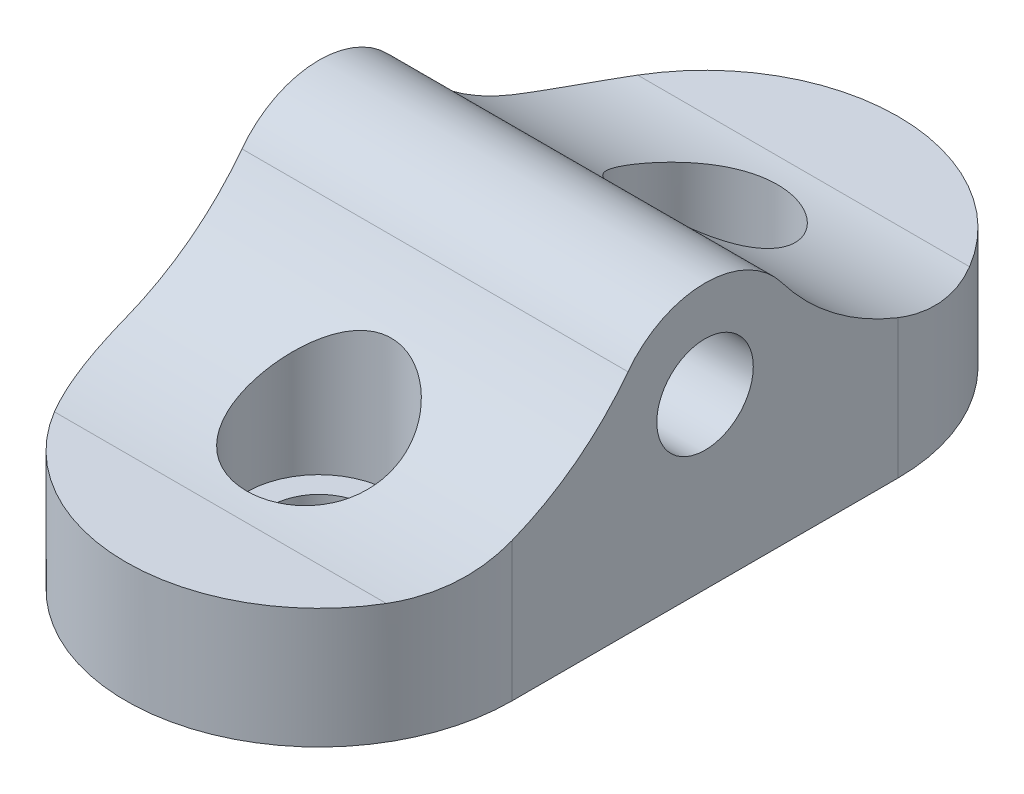
ISO-10303-21;
HEADER;
FILE_DESCRIPTION(('STEP AP214'),'2;1');
FILE_NAME('part.step','',(''),(''),'','','');
FILE_SCHEMA(('AUTOMOTIVE_DESIGN { 1 0 10303 214 1 1 1 1 }'));
ENDSEC;
DATA;
#1=APPLICATION_CONTEXT('core data for automotive mechanical design processes');
#2=APPLICATION_PROTOCOL_DEFINITION('international standard','automotive_design',2000,#1);
#3=PRODUCT_CONTEXT('',#1,'mechanical');
#4=PRODUCT('Part','Part','',(#3));
#5=PRODUCT_RELATED_PRODUCT_CATEGORY('part','',(#4));
#6=PRODUCT_DEFINITION_FORMATION('','',#4);
#7=PRODUCT_DEFINITION_CONTEXT('part definition',#1,'design');
#8=PRODUCT_DEFINITION('design','',#6,#7);
#9=PRODUCT_DEFINITION_SHAPE('','',#8);
#10=(LENGTH_UNIT() NAMED_UNIT(*) SI_UNIT(.MILLI.,.METRE.));
#11=(NAMED_UNIT(*) PLANE_ANGLE_UNIT() SI_UNIT($,.RADIAN.));
#12=(NAMED_UNIT(*) SI_UNIT($,.STERADIAN.) SOLID_ANGLE_UNIT());
#13=UNCERTAINTY_MEASURE_WITH_UNIT(LENGTH_MEASURE(1.E-05),#10,'distance_accuracy_value','');
#14=(GEOMETRIC_REPRESENTATION_CONTEXT(3) GLOBAL_UNCERTAINTY_ASSIGNED_CONTEXT((#13)) GLOBAL_UNIT_ASSIGNED_CONTEXT((#10,
#11,#12)) REPRESENTATION_CONTEXT('',''));
#15=CARTESIAN_POINT('',(0.,0.,0.));
#16=DIRECTION('',(0.,0.,1.));
#17=DIRECTION('',(1.,0.,0.));
#18=AXIS2_PLACEMENT_3D('',#15,#16,#17);
#19=CARTESIAN_POINT('',(0.,25.4,-12.7));
#20=DIRECTION('',(0.,-1.,0.));
#21=DIRECTION('',(0.,0.,-1.));
#22=AXIS2_PLACEMENT_3D('',#19,#20,#21);
#23=CYLINDRICAL_SURFACE('',#22,3.175);
#24=CARTESIAN_POINT('',(0.,0.,-12.7));
#25=DIRECTION('',(0.,1.,0.));
#26=DIRECTION('',(0.,0.,1.));
#27=AXIS2_PLACEMENT_3D('',#24,#25,#26);
#28=CIRCLE('',#27,3.175);
#29=CARTESIAN_POINT('',(0.,0.,-9.525));
#30=VERTEX_POINT('',#29);
#31=EDGE_CURVE('E225',#30,#30,#28,.T.);
#32=ORIENTED_EDGE('',*,*,#31,.F.);
#33=EDGE_LOOP('',(#32));
#34=FACE_BOUND('',#33,.T.);
#35=CARTESIAN_POINT('',(0.,3.175,-12.7));
#36=DIRECTION('',(0.,1.,0.));
#37=DIRECTION('',(0.,0.,1.));
#38=AXIS2_PLACEMENT_3D('',#35,#36,#37);
#39=CIRCLE('',#38,3.175);
#40=CARTESIAN_POINT('',(0.,3.175,-9.525));
#41=VERTEX_POINT('',#40);
#42=EDGE_CURVE('E42',#41,#41,#39,.T.);
#43=ORIENTED_EDGE('',*,*,#42,.T.);
#44=EDGE_LOOP('',(#43));
#45=FACE_BOUND('',#44,.T.);
#46=ADVANCED_FACE('F37',(#34,#45),#23,.F.);
#47=CARTESIAN_POINT('',(0.,25.4,12.7));
#48=DIRECTION('',(0.,-1.,0.));
#49=DIRECTION('',(0.,0.,-1.));
#50=AXIS2_PLACEMENT_3D('',#47,#48,#49);
#51=CYLINDRICAL_SURFACE('',#50,3.175);
#52=CARTESIAN_POINT('',(0.,0.,12.7));
#53=DIRECTION('',(0.,1.,0.));
#54=DIRECTION('',(0.,0.,1.));
#55=AXIS2_PLACEMENT_3D('',#52,#53,#54);
#56=CIRCLE('',#55,3.175);
#57=CARTESIAN_POINT('',(0.,0.,15.875));
#58=VERTEX_POINT('',#57);
#59=EDGE_CURVE('E222',#58,#58,#56,.T.);
#60=ORIENTED_EDGE('',*,*,#59,.F.);
#61=EDGE_LOOP('',(#60));
#62=FACE_BOUND('',#61,.T.);
#63=CARTESIAN_POINT('',(0.,3.175,12.7));
#64=DIRECTION('',(0.,1.,0.));
#65=DIRECTION('',(0.,0.,1.));
#66=AXIS2_PLACEMENT_3D('',#63,#64,#65);
#67=CIRCLE('',#66,3.175);
#68=CARTESIAN_POINT('',(0.,3.175,15.875));
#69=VERTEX_POINT('',#68);
#70=EDGE_CURVE('E393',#69,#69,#67,.T.);
#71=ORIENTED_EDGE('',*,*,#70,.T.);
#72=EDGE_LOOP('',(#71));
#73=FACE_BOUND('',#72,.T.);
#74=ADVANCED_FACE('F268',(#62,#73),#51,.F.);
#75=CARTESIAN_POINT('',(0.,0.,-12.7));
#76=DIRECTION('',(0.,1.,0.));
#77=DIRECTION('',(0.,0.,1.));
#78=AXIS2_PLACEMENT_3D('',#75,#76,#77);
#79=PLANE('',#78);
#80=CARTESIAN_POINT('',(0.,0.,-12.7));
#81=DIRECTION('',(0.,1.,0.));
#82=DIRECTION('',(0.,0.,1.));
#83=AXIS2_PLACEMENT_3D('',#80,#81,#82);
#84=CIRCLE('',#83,12.7);
#85=CARTESIAN_POINT('',(12.7,0.,-12.7));
#86=VERTEX_POINT('',#85);
#87=CARTESIAN_POINT('',(-12.7,0.,-12.7));
#88=VERTEX_POINT('',#87);
#89=EDGE_CURVE('E228',#86,#88,#84,.T.);
#90=ORIENTED_EDGE('',*,*,#89,.F.);
#91=DIRECTION('',(0.,0.,-1.));
#92=VECTOR('',#91,1.);
#93=CARTESIAN_POINT('',(12.7,0.,-12.7));
#94=LINE('',#93,#92);
#95=CARTESIAN_POINT('',(12.7,0.,12.7));
#96=VERTEX_POINT('',#95);
#97=EDGE_CURVE('E236',#96,#86,#94,.T.);
#98=ORIENTED_EDGE('',*,*,#97,.F.);
#99=CARTESIAN_POINT('',(0.,0.,12.7));
#100=DIRECTION('',(0.,1.,0.));
#101=DIRECTION('',(0.,0.,1.));
#102=AXIS2_PLACEMENT_3D('',#99,#100,#101);
#103=CIRCLE('',#102,12.7);
#104=CARTESIAN_POINT('',(-12.7,0.,12.7));
#105=VERTEX_POINT('',#104);
#106=EDGE_CURVE('E233',#105,#96,#103,.T.);
#107=ORIENTED_EDGE('',*,*,#106,.F.);
#108=DIRECTION('',(0.,0.,1.));
#109=VECTOR('',#108,1.);
#110=CARTESIAN_POINT('',(-12.7,0.,-12.7));
#111=LINE('',#110,#109);
#112=EDGE_CURVE('E230',#88,#105,#111,.T.);
#113=ORIENTED_EDGE('',*,*,#112,.F.);
#114=EDGE_LOOP('',(#90,#98,#107,#113));
#115=FACE_BOUND('',#114,.T.);
#116=ORIENTED_EDGE('',*,*,#31,.T.);
#117=EDGE_LOOP('',(#116));
#118=FACE_BOUND('',#117,.T.);
#119=ORIENTED_EDGE('',*,*,#59,.T.);
#120=EDGE_LOOP('',(#119));
#121=FACE_BOUND('',#120,.T.);
#122=ADVANCED_FACE('F256',(#115,#118,#121),#79,.F.);
#123=CARTESIAN_POINT('',(0.,25.4,-12.7));
#124=DIRECTION('',(0.,-1.,0.));
#125=DIRECTION('',(0.,0.,-1.));
#126=AXIS2_PLACEMENT_3D('',#123,#124,#125);
#127=CYLINDRICAL_SURFACE('',#126,12.7);
#128=CARTESIAN_POINT('',(-12.7,9.13804033762749,-12.7));
#129=CARTESIAN_POINT('',(-12.7000005866934,9.08164824123594,-12.843059101073));
#130=CARTESIAN_POINT('',(-12.6975820902846,9.02713059198029,-12.9868404265366));
#131=CARTESIAN_POINT('',(-12.6877707355619,8.9219084830553,-13.2756338677902));
#132=CARTESIAN_POINT('',(-12.6803775366066,8.87120428477524,-13.4206460671926));
#133=CARTESIAN_POINT('',(-12.6505310218572,8.72491450433517,-13.8571938798743));
#134=CARTESIAN_POINT('',(-12.6204107600428,8.63515756392982,-14.1502259139768));
#135=CARTESIAN_POINT('',(-12.5400606883423,8.47384705248073,-14.7298227684027));
#136=CARTESIAN_POINT('',(-12.4903963556061,8.40186707820088,-15.0163483411766));
#137=CARTESIAN_POINT('',(-12.3706126521038,8.27309288523471,-15.5884793354811));
#138=CARTESIAN_POINT('',(-12.3004985880759,8.21629473415985,-15.8740849763196));
#139=CARTESIAN_POINT('',(-12.1467715140994,8.12188635151893,-16.4173329046593));
#140=CARTESIAN_POINT('',(-12.064864665661,8.08303629254419,-16.6752453581526));
#141=CARTESIAN_POINT('',(-11.8841638650542,8.01728105812456,-17.186671235499));
#142=CARTESIAN_POINT('',(-11.78536816929,7.99037711702351,-17.4401842021718));
#143=CARTESIAN_POINT('',(-11.568579162017,7.94732446901488,-17.947467612124));
#144=CARTESIAN_POINT('',(-11.4501624028256,7.93146593255324,-18.2010814237486));
#145=CARTESIAN_POINT('',(-11.1966742750403,7.91066459405406,-18.7002571243969));
#146=CARTESIAN_POINT('',(-11.061605826167,7.90571988124402,-18.9458204154736));
#147=CARTESIAN_POINT('',(-10.9185278440872,7.90575,-19.18658228329));
#148=B_SPLINE_CURVE_WITH_KNOTS('',3,(#128,#129,#130,#131,#132,#133,#134,#135,#136,#137,#138,
#139,#140,#141,#142,#143,#144,#145,#146,#147),.UNSPECIFIED.,.F.,.F.,(4,2,2,2,2,2,2,2,2,4),(0.,
0.461251892542678,0.922535372388279,1.8451498812733,2.74282995799088,3.64027729223213,
4.45960970021409,5.27902674679715,6.11923198368918,6.95929010729535),.UNSPECIFIED.);
#149=CARTESIAN_POINT('',(-12.7,9.13804033762749,-12.7));
#150=VERTEX_POINT('',#149);
#151=CARTESIAN_POINT('',(-10.9185278440872,7.90575,-19.18658228329));
#152=VERTEX_POINT('',#151);
#153=EDGE_CURVE('E216',#150,#152,#148,.T.);
#154=ORIENTED_EDGE('',*,*,#153,.T.);
#155=CARTESIAN_POINT('',(0.,7.90575,-12.7));
#156=DIRECTION('',(0.,-1.,0.));
#157=DIRECTION('',(0.,0.,-1.));
#158=AXIS2_PLACEMENT_3D('',#155,#156,#157);
#159=CIRCLE('',#158,12.7);
#160=CARTESIAN_POINT('',(10.9185278440873,7.90575,-19.18658228329));
#161=VERTEX_POINT('',#160);
#162=EDGE_CURVE('E12',#152,#161,#159,.T.);
#163=ORIENTED_EDGE('',*,*,#162,.T.);
#164=CARTESIAN_POINT('',(10.9185278440873,7.90575,-19.18658228329));
#165=CARTESIAN_POINT('',(10.9970706401114,7.90574930958121,-19.0543764777048));
#166=CARTESIAN_POINT('',(11.0732022836872,7.90723269483922,-18.920757120913));
#167=CARTESIAN_POINT('',(11.2205407794781,7.91334831121593,-18.6508910926291));
#168=CARTESIAN_POINT('',(11.2917473343572,7.91798073226486,-18.5146442631459));
#169=CARTESIAN_POINT('',(11.4978193995035,7.93687306533883,-18.1022713369251));
#170=CARTESIAN_POINT('',(11.6251286313526,7.95612808719573,-17.8225274170901));
#171=CARTESIAN_POINT('',(11.8555507161374,8.00842632953805,-17.2634296254019));
#172=CARTESIAN_POINT('',(11.9592247627264,8.04108263244161,-16.984269750784));
#173=CARTESIAN_POINT('',(12.146187340975,8.12092949943563,-16.4212975203358));
#174=CARTESIAN_POINT('',(12.2294811880783,8.16811626650899,-16.137486398265));
#175=CARTESIAN_POINT('',(12.3691794889657,8.27274784515276,-15.5923275219183));
#176=CARTESIAN_POINT('',(12.4272935442663,8.32894204342089,-15.3311750891658));
#177=CARTESIAN_POINT('',(12.5265465383385,8.45398553795211,-14.8086419047588));
#178=CARTESIAN_POINT('',(12.567683690104,8.52283616534178,-14.5472611319694));
#179=CARTESIAN_POINT('',(12.6341436598931,8.67501411020532,-14.0194311379533));
#180=CARTESIAN_POINT('',(12.6590389472424,8.75866429056236,-13.7530214929481));
#181=CARTESIAN_POINT('',(12.6919837970719,8.93880822507675,-13.2235715943371));
#182=CARTESIAN_POINT('',(12.7000364222955,9.03529964073266,-12.9605307367842));
#183=CARTESIAN_POINT('',(12.7,9.13804033762749,-12.7));
#184=B_SPLINE_CURVE_WITH_KNOTS('',3,(#164,#165,#166,#167,#168,#169,#170,#171,#172,#173,#174,
#175,#176,#177,#178,#179,#180,#181,#182,#183),.UNSPECIFIED.,.F.,.F.,(4,2,2,2,2,2,2,2,2,4),(0.,
0.461263801610389,0.922555426252143,1.84518950609271,2.74287517726624,3.64032646917472,
4.45965058198705,5.27906091570263,6.11925253231032,6.95929135150384),.UNSPECIFIED.);
#185=CARTESIAN_POINT('',(12.7,9.13804033762749,-12.7));
#186=VERTEX_POINT('',#185);
#187=EDGE_CURVE('E212',#161,#186,#184,.T.);
#188=ORIENTED_EDGE('',*,*,#187,.T.);
#189=DIRECTION('',(0.,-1.,0.));
#190=VECTOR('',#189,1.);
#191=CARTESIAN_POINT('',(12.7,25.4,-12.7));
#192=LINE('',#191,#190);
#193=EDGE_CURVE('E63',#186,#86,#192,.T.);
#194=ORIENTED_EDGE('',*,*,#193,.T.);
#195=ORIENTED_EDGE('',*,*,#89,.T.);
#196=DIRECTION('',(0.,-1.,0.));
#197=VECTOR('',#196,1.);
#198=CARTESIAN_POINT('',(-12.7,25.4,-12.7));
#199=LINE('',#198,#197);
#200=EDGE_CURVE('E243',#150,#88,#199,.T.);
#201=ORIENTED_EDGE('',*,*,#200,.F.);
#202=EDGE_LOOP('',(#154,#163,#188,#194,#195,#201));
#203=FACE_BOUND('',#202,.T.);
#204=ADVANCED_FACE('F39',(#203),#127,.T.);
#205=CARTESIAN_POINT('',(-12.7,25.4,-12.7));
#206=DIRECTION('',(1.,0.,0.));
#207=DIRECTION('',(0.,0.,-1.));
#208=AXIS2_PLACEMENT_3D('',#205,#206,#207);
#209=PLANE('',#208);
#210=CARTESIAN_POINT('',(-12.7,11.1125,0.));
#211=DIRECTION('',(1.,0.,0.));
#212=DIRECTION('',(0.,0.,-1.));
#213=AXIS2_PLACEMENT_3D('',#210,#211,#212);
#214=CIRCLE('',#213,3.175);
#215=CARTESIAN_POINT('',(-12.7,11.1125,-3.175));
#216=VERTEX_POINT('',#215);
#217=EDGE_CURVE('E145',#216,#216,#214,.T.);
#218=ORIENTED_EDGE('',*,*,#217,.T.);
#219=EDGE_LOOP('',(#218));
#220=FACE_BOUND('',#219,.T.);
#221=CARTESIAN_POINT('',(-12.7,11.1125,0.));
#222=DIRECTION('',(-1.,0.,0.));
#223=DIRECTION('',(0.,0.,1.));
#224=AXIS2_PLACEMENT_3D('',#221,#222,#223);
#225=CIRCLE('',#224,6.35);
#226=CARTESIAN_POINT('',(-12.7,14.937973950952,5.06835762852109));
#227=VERTEX_POINT('',#226);
#228=CARTESIAN_POINT('',(-12.7,14.937973950952,-5.06835762852109));
#229=VERTEX_POINT('',#228);
#230=EDGE_CURVE('E120',#227,#229,#225,.T.);
#231=ORIENTED_EDGE('',*,*,#230,.T.);
#232=CARTESIAN_POINT('',(-12.7,25.5940690036339,-19.18658228329));
#233=DIRECTION('',(1.,0.,0.));
#234=DIRECTION('',(0.,0.,-1.));
#235=AXIS2_PLACEMENT_3D('',#232,#233,#234);
#236=CIRCLE('',#235,17.6883190036339);
#237=EDGE_CURVE('E134',#229,#150,#236,.T.);
#238=ORIENTED_EDGE('',*,*,#237,.T.);
#239=ORIENTED_EDGE('',*,*,#200,.T.);
#240=ORIENTED_EDGE('',*,*,#112,.T.);
#241=DIRECTION('',(0.,-1.,0.));
#242=VECTOR('',#241,1.);
#243=CARTESIAN_POINT('',(-12.7,25.4,12.7));
#244=LINE('',#243,#242);
#245=CARTESIAN_POINT('',(-12.7,9.13804033762749,12.7));
#246=VERTEX_POINT('',#245);
#247=EDGE_CURVE('E241',#246,#105,#244,.T.);
#248=ORIENTED_EDGE('',*,*,#247,.F.);
#249=CARTESIAN_POINT('',(-12.7,25.5940690036339,19.18658228329));
#250=DIRECTION('',(1.,0.,0.));
#251=DIRECTION('',(0.,0.,-1.));
#252=AXIS2_PLACEMENT_3D('',#249,#250,#251);
#253=CIRCLE('',#252,17.6883190036339);
#254=EDGE_CURVE('E128',#246,#227,#253,.T.);
#255=ORIENTED_EDGE('',*,*,#254,.T.);
#256=EDGE_LOOP('',(#231,#238,#239,#240,#248,#255));
#257=FACE_BOUND('',#256,.T.);
#258=ADVANCED_FACE('F250',(#220,#257),#209,.F.);
#259=CARTESIAN_POINT('',(0.,25.4,12.7));
#260=DIRECTION('',(0.,-1.,0.));
#261=DIRECTION('',(0.,0.,-1.));
#262=AXIS2_PLACEMENT_3D('',#259,#260,#261);
#263=CYLINDRICAL_SURFACE('',#262,12.7);
#264=DIRECTION('',(0.,-1.,0.));
#265=VECTOR('',#264,1.);
#266=CARTESIAN_POINT('',(12.7,25.4,12.7));
#267=LINE('',#266,#265);
#268=CARTESIAN_POINT('',(12.7,9.13804033762749,12.7));
#269=VERTEX_POINT('',#268);
#270=EDGE_CURVE('E239',#269,#96,#267,.T.);
#271=ORIENTED_EDGE('',*,*,#270,.F.);
#272=CARTESIAN_POINT('',(12.7,9.13804033762749,12.7));
#273=CARTESIAN_POINT('',(12.7000005866934,9.08164824123594,12.843059101073));
#274=CARTESIAN_POINT('',(12.6975820902847,9.02713059198029,12.9868404265366));
#275=CARTESIAN_POINT('',(12.6877707355619,8.9219084830553,13.2756338677902));
#276=CARTESIAN_POINT('',(12.6803775366067,8.87120428477524,13.4206460671926));
#277=CARTESIAN_POINT('',(12.6505310218572,8.72491450433516,13.8571938798743));
#278=CARTESIAN_POINT('',(12.6204107600428,8.63515756392982,14.1502259139768));
#279=CARTESIAN_POINT('',(12.5400606883423,8.47384705248072,14.7298227684027));
#280=CARTESIAN_POINT('',(12.4903963556061,8.40186707820088,15.0163483411766));
#281=CARTESIAN_POINT('',(12.3706126521038,8.27309288523471,15.5884793354811));
#282=CARTESIAN_POINT('',(12.3004985880759,8.21629473415985,15.8740849763196));
#283=CARTESIAN_POINT('',(12.1467715140994,8.12188635151893,16.4173329046593));
#284=CARTESIAN_POINT('',(12.064864665661,8.08303629254419,16.6752453581526));
#285=CARTESIAN_POINT('',(11.8841638650543,8.01728105812456,17.186671235499));
#286=CARTESIAN_POINT('',(11.78536816929,7.99037711702351,17.4401842021718));
#287=CARTESIAN_POINT('',(11.568579162017,7.94732446901488,17.947467612124));
#288=CARTESIAN_POINT('',(11.4501624028256,7.93146593255324,18.2010814237486));
#289=CARTESIAN_POINT('',(11.1966742750403,7.91066459405407,18.700257124397));
#290=CARTESIAN_POINT('',(11.061605826167,7.90571988124402,18.9458204154736));
#291=CARTESIAN_POINT('',(10.9185278440873,7.90575,19.18658228329));
#292=B_SPLINE_CURVE_WITH_KNOTS('',3,(#272,#273,#274,#275,#276,#277,#278,#279,#280,#281,#282,
#283,#284,#285,#286,#287,#288,#289,#290,#291),.UNSPECIFIED.,.F.,.F.,(4,2,2,2,2,2,2,2,2,4),(0.,
0.461251892542679,0.922535372388281,1.8451498812733,2.74282995799088,3.64027729223213,
4.45960970021408,5.27902674679715,6.11923198368919,6.95929010729536),.UNSPECIFIED.);
#293=CARTESIAN_POINT('',(10.9185278440873,7.90575,19.18658228329));
#294=VERTEX_POINT('',#293);
#295=EDGE_CURVE('E55',#269,#294,#292,.T.);
#296=ORIENTED_EDGE('',*,*,#295,.T.);
#297=CARTESIAN_POINT('',(0.,7.90575,12.7));
#298=DIRECTION('',(0.,-1.,0.));
#299=DIRECTION('',(0.,0.,-1.));
#300=AXIS2_PLACEMENT_3D('',#297,#298,#299);
#301=CIRCLE('',#300,12.7);
#302=CARTESIAN_POINT('',(-10.9185278440872,7.90575,19.18658228329));
#303=VERTEX_POINT('',#302);
#304=EDGE_CURVE('E47',#294,#303,#301,.T.);
#305=ORIENTED_EDGE('',*,*,#304,.T.);
#306=CARTESIAN_POINT('',(-10.9185278440872,7.90575,19.18658228329));
#307=CARTESIAN_POINT('',(-10.9970706401114,7.90574930958121,19.0543764777049));
#308=CARTESIAN_POINT('',(-11.0732022836871,7.90723269483922,18.920757120913));
#309=CARTESIAN_POINT('',(-11.2205407794781,7.91334831121593,18.6508910926291));
#310=CARTESIAN_POINT('',(-11.2917473343572,7.91798073226486,18.5146442631459));
#311=CARTESIAN_POINT('',(-11.4978193995035,7.93687306533884,18.1022713369251));
#312=CARTESIAN_POINT('',(-11.6251286313525,7.95612808719574,17.8225274170901));
#313=CARTESIAN_POINT('',(-11.8555507161374,8.00842632953805,17.2634296254019));
#314=CARTESIAN_POINT('',(-11.9592247627264,8.04108263244161,16.984269750784));
#315=CARTESIAN_POINT('',(-12.146187340975,8.12092949943563,16.4212975203358));
#316=CARTESIAN_POINT('',(-12.2294811880782,8.16811626650898,16.137486398265));
#317=CARTESIAN_POINT('',(-12.3691794889657,8.27274784515275,15.5923275219183));
#318=CARTESIAN_POINT('',(-12.4272935442663,8.32894204342088,15.3311750891658));
#319=CARTESIAN_POINT('',(-12.5265465383384,8.4539855379521,14.8086419047588));
#320=CARTESIAN_POINT('',(-12.567683690104,8.52283616534178,14.5472611319694));
#321=CARTESIAN_POINT('',(-12.6341436598931,8.67501411020532,14.0194311379533));
#322=CARTESIAN_POINT('',(-12.6590389472424,8.75866429056235,13.7530214929481));
#323=CARTESIAN_POINT('',(-12.6919837970719,8.93880822507675,13.2235715943371));
#324=CARTESIAN_POINT('',(-12.7000364222955,9.03529964073266,12.9605307367842));
#325=CARTESIAN_POINT('',(-12.7,9.13804033762749,12.7));
#326=B_SPLINE_CURVE_WITH_KNOTS('',3,(#306,#307,#308,#309,#310,#311,#312,#313,#314,#315,#316,
#317,#318,#319,#320,#321,#322,#323,#324,#325),.UNSPECIFIED.,.F.,.F.,(4,2,2,2,2,2,2,2,2,4),(0.,
0.461263801610383,0.922555426252139,1.8451895060927,2.74287517726624,3.64032646917472,
4.45965058198705,5.27906091570263,6.11925253231032,6.95929135150385),.UNSPECIFIED.);
#327=EDGE_CURVE('E148',#303,#246,#326,.T.);
#328=ORIENTED_EDGE('',*,*,#327,.T.);
#329=ORIENTED_EDGE('',*,*,#247,.T.);
#330=ORIENTED_EDGE('',*,*,#106,.T.);
#331=EDGE_LOOP('',(#271,#296,#305,#328,#329,#330));
#332=FACE_BOUND('',#331,.T.);
#333=ADVANCED_FACE('F160',(#332),#263,.T.);
#334=CARTESIAN_POINT('',(12.7,25.4,-12.7));
#335=DIRECTION('',(-1.,0.,0.));
#336=DIRECTION('',(0.,0.,1.));
#337=AXIS2_PLACEMENT_3D('',#334,#335,#336);
#338=PLANE('',#337);
#339=CARTESIAN_POINT('',(12.7,11.1125,0.));
#340=DIRECTION('',(1.,0.,0.));
#341=DIRECTION('',(0.,0.,-1.));
#342=AXIS2_PLACEMENT_3D('',#339,#340,#341);
#343=CIRCLE('',#342,3.175);
#344=CARTESIAN_POINT('',(12.7,11.1125,-3.175));
#345=VERTEX_POINT('',#344);
#346=EDGE_CURVE('E140',#345,#345,#343,.T.);
#347=ORIENTED_EDGE('',*,*,#346,.F.);
#348=EDGE_LOOP('',(#347));
#349=FACE_BOUND('',#348,.T.);
#350=ORIENTED_EDGE('',*,*,#193,.F.);
#351=CARTESIAN_POINT('',(12.7,25.5940690036339,-19.18658228329));
#352=DIRECTION('',(1.,0.,0.));
#353=DIRECTION('',(0.,0.,-1.));
#354=AXIS2_PLACEMENT_3D('',#351,#352,#353);
#355=CIRCLE('',#354,17.6883190036339);
#356=CARTESIAN_POINT('',(12.7,14.937973950952,-5.06835762852109));
#357=VERTEX_POINT('',#356);
#358=EDGE_CURVE('E126',#357,#186,#355,.T.);
#359=ORIENTED_EDGE('',*,*,#358,.F.);
#360=CARTESIAN_POINT('',(12.7,11.1125,0.));
#361=DIRECTION('',(-1.,0.,0.));
#362=DIRECTION('',(0.,0.,1.));
#363=AXIS2_PLACEMENT_3D('',#360,#361,#362);
#364=CIRCLE('',#363,6.35);
#365=CARTESIAN_POINT('',(12.7,14.937973950952,5.06835762852109));
#366=VERTEX_POINT('',#365);
#367=EDGE_CURVE('E113',#366,#357,#364,.T.);
#368=ORIENTED_EDGE('',*,*,#367,.F.);
#369=CARTESIAN_POINT('',(12.7,25.5940690036339,19.18658228329));
#370=DIRECTION('',(1.,0.,0.));
#371=DIRECTION('',(0.,0.,-1.));
#372=AXIS2_PLACEMENT_3D('',#369,#370,#371);
#373=CIRCLE('',#372,17.6883190036339);
#374=EDGE_CURVE('E105',#269,#366,#373,.T.);
#375=ORIENTED_EDGE('',*,*,#374,.F.);
#376=ORIENTED_EDGE('',*,*,#270,.T.);
#377=ORIENTED_EDGE('',*,*,#97,.T.);
#378=EDGE_LOOP('',(#350,#359,#368,#375,#376,#377));
#379=FACE_BOUND('',#378,.T.);
#380=ADVANCED_FACE('F125',(#349,#379),#338,.F.);
#381=CARTESIAN_POINT('',(-12.7,7.90575,-19.18658228329));
#382=DIRECTION('',(0.,-1.,0.));
#383=DIRECTION('',(0.,0.,-1.));
#384=AXIS2_PLACEMENT_3D('',#381,#382,#383);
#385=PLANE('',#384);
#386=ORIENTED_EDGE('',*,*,#162,.F.);
#387=DIRECTION('',(1.,0.,0.));
#388=VECTOR('',#387,1.);
#389=CARTESIAN_POINT('',(-12.7,7.90575,-19.18658228329));
#390=LINE('',#389,#388);
#391=EDGE_CURVE('E137',#152,#161,#390,.T.);
#392=ORIENTED_EDGE('',*,*,#391,.T.);
#393=EDGE_LOOP('',(#386,#392));
#394=FACE_BOUND('',#393,.T.);
#395=ADVANCED_FACE('F203',(#394),#385,.F.);
#396=CARTESIAN_POINT('',(-12.7,7.90575,25.4));
#397=DIRECTION('',(0.,-1.,0.));
#398=DIRECTION('',(0.,0.,-1.));
#399=AXIS2_PLACEMENT_3D('',#396,#397,#398);
#400=PLANE('',#399);
#401=DIRECTION('',(1.,0.,0.));
#402=VECTOR('',#401,1.);
#403=CARTESIAN_POINT('',(-12.7,7.90575,19.18658228329));
#404=LINE('',#403,#402);
#405=EDGE_CURVE('E123',#303,#294,#404,.T.);
#406=ORIENTED_EDGE('',*,*,#405,.F.);
#407=ORIENTED_EDGE('',*,*,#304,.F.);
#408=EDGE_LOOP('',(#406,#407));
#409=FACE_BOUND('',#408,.T.);
#410=ADVANCED_FACE('F170',(#409),#400,.F.);
#411=CARTESIAN_POINT('',(-12.7,25.5940690036339,-19.18658228329));
#412=DIRECTION('',(1.,0.,0.));
#413=DIRECTION('',(0.,0.,-1.));
#414=AXIS2_PLACEMENT_3D('',#411,#412,#413);
#415=CYLINDRICAL_SURFACE('',#414,17.6883190036339);
#416=CARTESIAN_POINT('',(0.,11.9436193056171,-7.9375));
#417=CARTESIAN_POINT('',(-0.114547889188897,11.9436179371851,-7.93750117820442));
#418=CARTESIAN_POINT('',(-0.229137448629441,11.9402029616204,-7.94164166010331));
#419=CARTESIAN_POINT('',(-0.457375335535004,11.9266400650236,-7.95813069958161));
#420=CARTESIAN_POINT('',(-0.571022947808484,11.916487431502,-7.97048500212733));
#421=CARTESIAN_POINT('',(-0.796651433946876,11.8897112986826,-8.00321711280339));
#422=CARTESIAN_POINT('',(-0.908627990171046,11.8730733145297,-8.02361288251309));
#423=CARTESIAN_POINT('',(-1.12985188473524,11.8337883892044,-8.07207495469861));
#424=CARTESIAN_POINT('',(-1.23909789992839,11.8111385943535,-8.10014490013289));
#425=CARTESIAN_POINT('',(-1.55995887452641,11.7353986409865,-8.19474871849132));
#426=CARTESIAN_POINT('',(-1.76664752039363,11.6742708202301,-8.2719701778938));
#427=CARTESIAN_POINT('',(-2.16259431580371,11.5355543920586,-8.45123988847478));
#428=CARTESIAN_POINT('',(-2.35185487054196,11.4579680609273,-8.55328470676055));
#429=CARTESIAN_POINT('',(-2.73084313033479,11.2819934987394,-8.79113774151795));
#430=CARTESIAN_POINT('',(-2.91839567694296,11.1822618402615,-8.92940736573784));
#431=CARTESIAN_POINT('',(-3.26872584302175,10.9738666139177,-9.2286900956867));
#432=CARTESIAN_POINT('',(-3.4314876611264,10.8651974167351,-9.38971758205364));
#433=CARTESIAN_POINT('',(-3.76280480994887,10.6200343860175,-9.76768004966269));
#434=CARTESIAN_POINT('',(-3.92533609653092,10.4825076603848,-9.98924237764707));
#435=CARTESIAN_POINT('',(-4.21025906030397,10.207446651201,-10.4572016886412));
#436=CARTESIAN_POINT('',(-4.33262148703206,10.0699124347615,-10.7036165990612));
#437=CARTESIAN_POINT('',(-4.48801874703753,9.86191410910532,-11.0994962511783));
#438=CARTESIAN_POINT('',(-4.53636468187844,9.78940842213352,-11.2420542330515));
#439=CARTESIAN_POINT('',(-4.6195749554785,9.6468574633008,-11.5322278896405));
#440=CARTESIAN_POINT('',(-4.65444421475342,9.57681130194251,-11.679841696936));
#441=CARTESIAN_POINT('',(-4.71008969699553,9.43991910588595,-11.9791443412162));
#442=CARTESIAN_POINT('',(-4.73086683997036,9.37307286254502,-12.1308329115065));
#443=CARTESIAN_POINT('',(-4.75772426368844,9.24324777976056,-12.4371431288854));
#444=CARTESIAN_POINT('',(-4.76380596698426,9.18026856655484,-12.5917644906124));
#445=CARTESIAN_POINT('',(-4.76081758189668,9.06236220472126,-12.8934147404382));
#446=CARTESIAN_POINT('',(-4.75262182044623,9.0071791493659,-13.0403522079331));
#447=CARTESIAN_POINT('',(-4.72237361415267,8.90117616271615,-13.3343716074359));
#448=CARTESIAN_POINT('',(-4.70032277305867,8.85035572721481,-13.4814535207568));
#449=CARTESIAN_POINT('',(-4.64215189261785,8.75341814134725,-13.7742921861506));
#450=CARTESIAN_POINT('',(-4.60603991341115,8.70729831556833,-13.9200496485314));
#451=CARTESIAN_POINT('',(-4.51968886413408,8.619935618349,-14.2088144522196));
#452=CARTESIAN_POINT('',(-4.46945129896234,8.57869222805195,-14.3518220847526));
#453=CARTESIAN_POINT('',(-4.36098871776207,8.5052146354775,-14.6187808718062));
#454=CARTESIAN_POINT('',(-4.30414806566383,8.47248933882376,-14.74316112271));
#455=CARTESIAN_POINT('',(-4.17951624221301,8.41097645149724,-14.987319787314));
#456=CARTESIAN_POINT('',(-4.11172599044816,8.38218853052377,-15.1070985864165));
#457=CARTESIAN_POINT('',(-3.96560325483307,8.32844378914024,-15.3409086706227));
#458=CARTESIAN_POINT('',(-3.88727326368228,8.3034860658483,-15.4549413059837));
#459=CARTESIAN_POINT('',(-3.72058423655603,8.25720901605819,-15.6762129631118));
#460=CARTESIAN_POINT('',(-3.63222543666815,8.23588960394032,-15.7834521447105));
#461=CARTESIAN_POINT('',(-3.45135366626419,8.19774632121079,-15.9843255357153));
#462=CARTESIAN_POINT('',(-3.35935177840698,8.18073735486606,-16.078385474244));
#463=CARTESIAN_POINT('',(-3.16759029661782,8.14949525529041,-16.2588079172114));
#464=CARTESIAN_POINT('',(-3.06782814990844,8.13526304093372,-16.3451678684779));
#465=CARTESIAN_POINT('',(-2.86132091682726,8.10932362027178,-16.5094157112252));
#466=CARTESIAN_POINT('',(-2.75457875368203,8.09761536564941,-16.5873071133969));
#467=CARTESIAN_POINT('',(-2.53479412918261,8.0764408372531,-16.7340664738286));
#468=CARTESIAN_POINT('',(-2.42174934478455,8.06697539698328,-16.8029310731949));
#469=CARTESIAN_POINT('',(-2.19091575091341,8.05007780500577,-16.9306723710043));
#470=CARTESIAN_POINT('',(-2.07316024404463,8.04263355309823,-16.9896076685635));
#471=CARTESIAN_POINT('',(-1.83304988719154,8.0294557273015,-17.0975752702833));
#472=CARTESIAN_POINT('',(-1.71069337206171,8.02372277958986,-17.1466039474307));
#473=CARTESIAN_POINT('',(-1.46232577654667,8.01375678102027,-17.234352264714));
#474=CARTESIAN_POINT('',(-1.33631594314585,8.00952322474769,-17.2730753775518));
#475=CARTESIAN_POINT('',(-1.08143860186314,8.00237319014157,-17.339963641287));
#476=CARTESIAN_POINT('',(-0.952570051802777,7.99945720070444,-17.3681248724346));
#477=CARTESIAN_POINT('',(-0.691981890652635,7.99479314478654,-17.4138298712192));
#478=CARTESIAN_POINT('',(-0.560248407184176,7.99305366935494,-17.4312954522792));
#479=CARTESIAN_POINT('',(-0.295724385368391,7.99068954880663,-17.4551651933554));
#480=CARTESIAN_POINT('',(-0.16293347326091,7.99006531721113,-17.461565250358));
#481=CARTESIAN_POINT('',(0.102674739863418,7.98990086375874,-17.4632441381713));
#482=CARTESIAN_POINT('',(0.23549201650446,7.99036027291929,-17.4585267545008));
#483=CARTESIAN_POINT('',(0.500306402805661,7.99238636629105,-17.4380108087882));
#484=CARTESIAN_POINT('',(0.632303191271993,7.99395345958798,-17.4222081527916));
#485=CARTESIAN_POINT('',(0.894877014946981,7.99828019986899,-17.3795653874572));
#486=CARTESIAN_POINT('',(1.02544895454345,8.00104322045472,-17.3526940648636));
#487=CARTESIAN_POINT('',(1.28386535753718,8.00789502695134,-17.2881225890966));
#488=CARTESIAN_POINT('',(1.41170879126877,8.0119843042471,-17.2504184228912));
#489=CARTESIAN_POINT('',(1.78965714349827,8.02650021677786,-17.1214484053387));
#490=CARTESIAN_POINT('',(2.03446926823777,8.03917891187295,-17.0142777688007));
#491=CARTESIAN_POINT('',(2.50165178337812,8.07235543318744,-16.7612359916668));
#492=CARTESIAN_POINT('',(2.72407757570046,8.09283332469695,-16.6154638035366));
#493=CARTESIAN_POINT('',(3.14096235446882,8.14380854511624,-16.289663219361));
#494=CARTESIAN_POINT('',(3.33542416363258,8.17430486173214,-16.1096382850964));
#495=CARTESIAN_POINT('',(3.68953366130543,8.2471142470674,-15.7227482355949));
#496=CARTESIAN_POINT('',(3.84943579679595,8.28933532603598,-15.5160985179809));
#497=CARTESIAN_POINT('',(4.13226825174338,8.38718768127273,-15.081788118419));
#498=CARTESIAN_POINT('',(4.25520100268737,8.44281807517266,-14.8541288195651));
#499=CARTESIAN_POINT('',(4.4619310395346,8.56825275878141,-14.3847817451608));
#500=CARTESIAN_POINT('',(4.54564413132061,8.63808708413276,-14.1430650303498));
#501=CARTESIAN_POINT('',(4.67292072415897,8.79145529626749,-13.6535340248379));
#502=CARTESIAN_POINT('',(4.71647723569382,8.87499156498504,-13.4057186803342));
#503=CARTESIAN_POINT('',(4.76532849775239,9.05816743891324,-12.9004243747512));
#504=CARTESIAN_POINT('',(4.76893807357157,9.15833631815756,-12.642977046669));
#505=CARTESIAN_POINT('',(4.73575273367833,9.36962870050565,-12.1353496346675));
#506=CARTESIAN_POINT('',(4.69894550355016,9.48075553294693,-11.8851717894999));
#507=CARTESIAN_POINT('',(4.58264047170065,9.72131443249151,-11.3751323134543));
#508=CARTESIAN_POINT('',(4.49958898000523,9.85149337974005,-11.1164350877252));
#509=CARTESIAN_POINT('',(4.29213613007911,10.1167363322354,-10.6187054673332));
#510=CARTESIAN_POINT('',(4.16769849086949,10.2518045307102,-10.3796905572606));
#511=CARTESIAN_POINT('',(3.86675784749793,10.5342269257043,-9.90427724476177));
#512=CARTESIAN_POINT('',(3.68645234495953,10.6815389242792,-9.67024984100993));
#513=CARTESIAN_POINT('',(3.28244531883115,10.9672722190954,-9.2366699612169));
#514=CARTESIAN_POINT('',(3.05877235310275,11.1056992867313,-9.03709496056085));
#515=CARTESIAN_POINT('',(2.62372830232032,11.3349420310702,-8.71835486066388));
#516=CARTESIAN_POINT('',(2.42026062372023,11.4295650258103,-8.59114159732622));
#517=CARTESIAN_POINT('',(1.99033101349314,11.6003644957895,-8.3665656646946));
#518=CARTESIAN_POINT('',(1.76389410904453,11.6765607486955,-8.26917096059828));
#519=CARTESIAN_POINT('',(1.32880713832968,11.7935240803008,-8.12181316880749));
#520=CARTESIAN_POINT('',(1.12288419323628,11.8379618762686,-8.06682375647975));
#521=CARTESIAN_POINT('',(0.807691634342047,11.8880318649627,-8.00526607856282));
#522=CARTESIAN_POINT('',(0.701665404735306,11.9019527842116,-7.98823998976214));
#523=CARTESIAN_POINT('',(0.488130177004365,11.9239779974117,-7.96136258439902));
#524=CARTESIAN_POINT('',(0.380622109486057,11.9320857863235,-7.95150695677134));
#525=CARTESIAN_POINT('',(0.227412040315864,11.9393231961363,-7.94271491311649));
#526=CARTESIAN_POINT('',(0.181971180832007,11.9409330753753,-7.94076032932393));
#527=CARTESIAN_POINT('',(0.0910224113212758,11.9430814550732,-7.9381525742016));
#528=CARTESIAN_POINT('',(0.0455144950963664,11.9436198493503,-7.93749953185187));
#529=CARTESIAN_POINT('',(0.,11.9436193056171,-7.9375));
#530=B_SPLINE_CURVE_WITH_KNOTS('',3,(#416,#417,#418,#419,#420,#421,#422,#423,#424,#425,#426,
#427,#428,#429,#430,#431,#432,#433,#434,#435,#436,#437,#438,#439,#440,#441,#442,#443,#444,#445,
#446,#447,#448,#449,#450,#451,#452,#453,#454,#455,#456,#457,#458,#459,#460,#461,#462,#463,#464,
#465,#466,#467,#468,#469,#470,#471,#472,#473,#474,#475,#476,#477,#478,#479,#480,#481,#482,#483,
#484,#485,#486,#487,#488,#489,#490,#491,#492,#493,#494,#495,#496,#497,#498,#499,#500,#501,#502,
#503,#504,#505,#506,#507,#508,#509,#510,#511,#512,#513,#514,#515,#516,#517,#518,#519,#520,#521,
#522,#523,#524,#525,#526,#527,#528,#529),.UNSPECIFIED.,.T.,.F.,(4,2,2,2,2,2,2,2,2,2,2,2,2,2,2,2,
2,2,2,2,2,2,2,2,2,2,2,2,2,2,2,2,2,2,2,2,2,2,2,2,2,2,2,2,2,2,2,2,2,2,2,2,2,2,2,2,4),(0.,
0.343591076141197,0.687422722258843,1.03202674833781,1.37679464406306,2.06044411561285,
2.74399909703134,3.50168311217546,4.25984806466207,5.17798770743827,6.09679445262211,
6.59750775269216,7.09803806249752,7.59853569189941,8.09898487003113,8.56985409399523,
9.04066882408148,9.51121406962895,9.98170920364425,10.4030104060556,10.8242762444191,
11.2454426259173,11.666599094818,12.0641301830613,12.4617925987728,12.8592895273074,
13.2569339479898,13.6521425043127,14.0474954933043,14.4427150896528,14.8380812160124,
15.23630405519,15.6346745207737,16.0329093597303,16.4312913501679,16.8308045397202,
17.2304659203659,18.0289207423044,18.8253482669408,19.6216953427187,20.4119628843312,
21.2021784384465,21.994082687643,22.7861247469858,23.6114580231132,24.4370428361362,
25.3371518653498,26.2380520601493,27.223884933019,28.2090708175559,28.9800026944525,
29.7501034104863,30.4001952567473,30.724710631105,31.0490307368976,31.1855397984023,
31.3220623869975),.UNSPECIFIED.);
#531=CARTESIAN_POINT('',(0.,11.9436193056171,-7.9375));
#532=VERTEX_POINT('',#531);
#533=EDGE_CURVE('E181',#532,#532,#530,.T.);
#534=ORIENTED_EDGE('',*,*,#533,.T.);
#535=EDGE_LOOP('',(#534));
#536=FACE_BOUND('',#535,.T.);
#537=ORIENTED_EDGE('',*,*,#237,.F.);
#538=DIRECTION('',(1.,0.,0.));
#539=VECTOR('',#538,1.);
#540=CARTESIAN_POINT('',(-12.7,14.937973950952,-5.06835762852109));
#541=LINE('',#540,#539);
#542=EDGE_CURVE('E122',#229,#357,#541,.T.);
#543=ORIENTED_EDGE('',*,*,#542,.T.);
#544=ORIENTED_EDGE('',*,*,#358,.T.);
#545=ORIENTED_EDGE('',*,*,#187,.F.);
#546=ORIENTED_EDGE('',*,*,#391,.F.);
#547=ORIENTED_EDGE('',*,*,#153,.F.);
#548=EDGE_LOOP('',(#537,#543,#544,#545,#546,#547));
#549=FACE_BOUND('',#548,.T.);
#550=ADVANCED_FACE('F167',(#536,#549),#415,.F.);
#551=CARTESIAN_POINT('',(-12.7,25.5940690036339,19.18658228329));
#552=DIRECTION('',(1.,0.,0.));
#553=DIRECTION('',(0.,0.,-1.));
#554=AXIS2_PLACEMENT_3D('',#551,#552,#553);
#555=CYLINDRICAL_SURFACE('',#554,17.6883190036339);
#556=CARTESIAN_POINT('',(0.,7.98997375693742,17.4625));
#557=CARTESIAN_POINT('',(-0.132733125485733,7.98997352181435,17.4624992923767));
#558=CARTESIAN_POINT('',(-0.26550990547606,7.99051502543776,17.4569453385886));
#559=CARTESIAN_POINT('',(-0.530183414710336,7.99270900361594,17.4347614181203));
#560=CARTESIAN_POINT('',(-0.662079561601876,7.9943621515202,17.4181247384254));
#561=CARTESIAN_POINT('',(-0.924275653976565,7.99886766113171,17.3738453525589));
#562=CARTESIAN_POINT('',(-1.05457177076712,8.0017224754997,17.3461801427601));
#563=CARTESIAN_POINT('',(-1.31240417962667,8.00876796494669,17.2800352164051));
#564=CARTESIAN_POINT('',(-1.43993940231082,8.01295914809736,17.2415513873972));
#565=CARTESIAN_POINT('',(-1.69114577446894,8.02285335731104,17.1541103803493));
#566=CARTESIAN_POINT('',(-1.81482113470975,8.02855466657053,17.1051651076395));
#567=CARTESIAN_POINT('',(-2.05761608268886,8.04169403940542,16.9971251081377));
#568=CARTESIAN_POINT('',(-2.17673397122358,8.04913274354548,16.9380266400677));
#569=CARTESIAN_POINT('',(-2.40939250423804,8.06598762735543,16.8102108367133));
#570=CARTESIAN_POINT('',(-2.52293854214585,8.07540184624681,16.7415030614414));
#571=CARTESIAN_POINT('',(-2.74380225277108,8.09648402307309,16.5949360897913));
#572=CARTESIAN_POINT('',(-2.85111763338107,8.10815280365974,16.5170735570678));
#573=CARTESIAN_POINT('',(-3.05822802810834,8.13395670363929,16.3532182191175));
#574=CARTESIAN_POINT('',(-3.1580552526358,8.14808027525851,16.2672643084662));
#575=CARTESIAN_POINT('',(-3.35006348985819,8.17909857951883,16.0875912209959));
#576=CARTESIAN_POINT('',(-3.44224168230636,8.19599432750313,15.9938692052613));
#577=CARTESIAN_POINT('',(-3.61824600562956,8.23278842667162,15.7994975612324));
#578=CARTESIAN_POINT('',(-3.70207520435227,8.25268566814498,15.6988505007114));
#579=CARTESIAN_POINT('',(-3.86090120415073,8.29570238204035,15.4914010349993));
#580=CARTESIAN_POINT('',(-3.93589475400565,8.31882303377855,15.3845963854193));
#581=CARTESIAN_POINT('',(-4.07611172446313,8.36828405021191,15.1664596111073));
#582=CARTESIAN_POINT('',(-4.14139431572434,8.39460297596532,15.0551606454592));
#583=CARTESIAN_POINT('',(-4.26243550357919,8.45068774073641,14.8282832732722));
#584=CARTESIAN_POINT('',(-4.31819064910788,8.480454822234,14.7127033344315));
#585=CARTESIAN_POINT('',(-4.41989387911921,8.54346299188628,14.4782732934506));
#586=CARTESIAN_POINT('',(-4.46584566432224,8.57670276203392,14.359424444503));
#587=CARTESIAN_POINT('',(-4.54785732183,8.64663964088506,14.1193388621743));
#588=CARTESIAN_POINT('',(-4.58391346904902,8.68333804458231,13.9981012479294));
#589=CARTESIAN_POINT('',(-4.67831822838966,8.79997783580784,13.6275645458707));
#590=CARTESIAN_POINT('',(-4.72103260057987,8.88531173216956,13.3757888503654));
#591=CARTESIAN_POINT('',(-4.76603741199602,9.06856962567004,12.8734035210687));
#592=CARTESIAN_POINT('',(-4.76831593717342,9.16649732489617,12.6227942526976));
#593=CARTESIAN_POINT('',(-4.73340689743218,9.37982958470615,12.1114915651538));
#594=CARTESIAN_POINT('',(-4.69348769443684,9.49597357848585,11.8512940314355));
#595=CARTESIAN_POINT('',(-4.572985217087,9.73661989746842,11.3445950711434));
#596=CARTESIAN_POINT('',(-4.49238766660131,9.86112514375791,11.0980984866785));
#597=CARTESIAN_POINT('',(-4.28345304546229,10.1273570274929,10.5990733541817));
#598=CARTESIAN_POINT('',(-4.15109803312362,10.2695482536919,10.3484758437802));
#599=CARTESIAN_POINT('',(-3.84369760679285,10.5532869575233,9.87379610731703));
#600=CARTESIAN_POINT('',(-3.6685976404193,10.6948333752033,9.64974831188614));
#601=CARTESIAN_POINT('',(-3.37049618028766,10.9046173216219,9.33193256685892));
#602=CARTESIAN_POINT('',(-3.26182573073509,10.975969198244,9.22652374871009));
#603=CARTESIAN_POINT('',(-3.03353269368351,11.1150085150614,9.02546342904874));
#604=CARTESIAN_POINT('',(-2.913908143745,11.1826952951805,8.92981368239969));
#605=CARTESIAN_POINT('',(-2.66432790725499,11.3127382002826,8.74950579714567));
#606=CARTESIAN_POINT('',(-2.53439272848548,11.3751044191066,8.66482667989632));
#607=CARTESIAN_POINT('',(-2.26462076444444,11.4929040550444,8.50747045325868));
#608=CARTESIAN_POINT('',(-2.12478941504327,11.5483412326265,8.43478682685969));
#609=CARTESIAN_POINT('',(-1.78439560538394,11.6686153147116,8.27918976612761));
#610=CARTESIAN_POINT('',(-1.57989107314747,11.7298063627293,8.20179957938701));
#611=CARTESIAN_POINT('',(-1.26331146187059,11.8058015481045,8.10678336881124));
#612=CARTESIAN_POINT('',(-1.15614969509348,11.828501127038,8.07862310994669));
#613=CARTESIAN_POINT('',(-0.939123502966601,11.8681312396468,8.0296894626874));
#614=CARTESIAN_POINT('',(-0.829260377444024,11.8850644918663,8.00891259318006));
#615=CARTESIAN_POINT('',(-0.606890904679113,11.9128019139207,7.97497913264644));
#616=CARTESIAN_POINT('',(-0.494372403440951,11.9235674861374,7.96187051938942));
#617=CARTESIAN_POINT('',(-0.268292207490961,11.9384975641654,7.94371176829598));
#618=CARTESIAN_POINT('',(-0.154730960541197,11.9426647812127,7.93865832062058));
#619=CARTESIAN_POINT('',(0.0725308446226066,11.9442815343987,7.93669637671378));
#620=CARTESIAN_POINT('',(0.186231425007146,11.9417298079048,7.93978941137982));
#621=CARTESIAN_POINT('',(0.412770783817417,11.9299829116449,7.95406408471068));
#622=CARTESIAN_POINT('',(0.525609599121654,11.9207880277954,7.9652453752631));
#623=CARTESIAN_POINT('',(0.74007815633901,11.8970654398195,7.99421703826235));
#624=CARTESIAN_POINT('',(0.841851760577694,11.8830519079053,8.01137170364692));
#625=CARTESIAN_POINT('',(1.04330312969694,11.8500027971906,8.05204347913377));
#626=CARTESIAN_POINT('',(1.14298017943794,11.8309655338437,8.07556272346008));
#627=CARTESIAN_POINT('',(1.437993453134,11.7669066223793,8.15522295516884));
#628=CARTESIAN_POINT('',(1.62944766210987,11.7149220251594,8.22048531339942));
#629=CARTESIAN_POINT('',(2.01423243242262,11.5911014012451,8.37897358387174));
#630=CARTESIAN_POINT('',(2.20633610355772,11.5179524713501,8.47410659381825));
#631=CARTESIAN_POINT('',(2.5722522321807,11.3589531051888,8.68631098038515));
#632=CARTESIAN_POINT('',(2.74605493698482,11.2730959546829,8.80339396278698));
#633=CARTESIAN_POINT('',(3.10799154769999,11.0742601432193,9.08277937109347));
#634=CARTESIAN_POINT('',(3.29170177930577,10.959337944241,9.24942844729561));
#635=CARTESIAN_POINT('',(3.62944204145352,10.7230646422614,9.60661301798169));
#636=CARTESIAN_POINT('',(3.7834480048625,10.6017084269003,9.79716767678462));
#637=CARTESIAN_POINT('',(4.08474562001448,10.3358491351182,10.234497463195));
#638=CARTESIAN_POINT('',(4.22602907075202,10.1910493882827,10.4852546588282));
#639=CARTESIAN_POINT('',(4.46204718002062,9.90592732005731,11.0105225016441));
#640=CARTESIAN_POINT('',(4.55676420656007,9.76560671343219,11.2850421000656));
#641=CARTESIAN_POINT('',(4.66176831871078,9.56081653518387,11.7141094121351));
#642=CARTESIAN_POINT('',(4.69073360071916,9.49248828804009,11.862458720933));
#643=CARTESIAN_POINT('',(4.73452477202559,9.35926371476728,12.1627214250416));
#644=CARTESIAN_POINT('',(4.74935681791697,9.29436590594894,12.3146332389102));
#645=CARTESIAN_POINT('',(4.76430702962123,9.16864705932045,12.6207968581205));
#646=CARTESIAN_POINT('',(4.76442976523783,9.10782476122318,12.7750479218229));
#647=CARTESIAN_POINT('',(4.74947519703762,8.99077773347317,13.0845577479537));
#648=CARTESIAN_POINT('',(4.73439976553253,8.93455243842305,13.2398163839151));
#649=CARTESIAN_POINT('',(4.6907502607113,8.83197537115152,13.5358181044092));
#650=CARTESIAN_POINT('',(4.66351416619683,8.78519042205982,13.676609172886));
#651=CARTESIAN_POINT('',(4.59602507735821,8.69602432636812,13.9564510589083));
#652=CARTESIAN_POINT('',(4.5557735866332,8.65364267182596,14.0955020755462));
#653=CARTESIAN_POINT('',(4.4622940900993,8.57343356587973,14.3704529816255));
#654=CARTESIAN_POINT('',(4.40907182811363,8.53560410967976,14.5063542367785));
#655=CARTESIAN_POINT('',(4.28984024893816,8.46450624142849,14.773665566855));
#656=CARTESIAN_POINT('',(4.22383190335266,8.43123748314123,14.9050759821418));
#657=CARTESIAN_POINT('',(4.0861766072551,8.37208143723056,15.1499828166869));
#658=CARTESIAN_POINT('',(4.0156342524145,8.34579480496788,15.2640052516003));
#659=CARTESIAN_POINT('',(3.86475301841521,8.29675572949349,15.4862397392352));
#660=CARTESIAN_POINT('',(3.78441098878587,8.27400442821939,15.5944499071979));
#661=CARTESIAN_POINT('',(3.61453756522852,8.23186691473071,15.8039819962985));
#662=CARTESIAN_POINT('',(3.52501207112201,8.21247856330472,15.9053082712185));
#663=CARTESIAN_POINT('',(3.33732948559808,8.17680052181022,16.1002873386028));
#664=CARTESIAN_POINT('',(3.23916942947216,8.16051190216636,16.1939374739475));
#665=CARTESIAN_POINT('',(3.03852749389606,8.13128420756621,16.3695929763337));
#666=CARTESIAN_POINT('',(2.93631496839611,8.11824827898282,16.4518902034393));
#667=CARTESIAN_POINT('',(2.7252660720402,8.09455000667993,16.6078829735276));
#668=CARTESIAN_POINT('',(2.61642975023739,8.08388764538546,16.6815785801985));
#669=CARTESIAN_POINT('',(2.39282020214562,8.06466357817767,16.8198435125391));
#670=CARTESIAN_POINT('',(2.2780426636082,8.05610342472436,16.8844060787188));
#671=CARTESIAN_POINT('',(2.04347628200742,8.04084045495844,17.0038268943179));
#672=CARTESIAN_POINT('',(1.92368912079725,8.03413702097031,17.0586883688013));
#673=CARTESIAN_POINT('',(1.67941851306008,8.02232608674953,17.1585243806255));
#674=CARTESIAN_POINT('',(1.55491797333281,8.01722517686168,17.2034578704516));
#675=CARTESIAN_POINT('',(1.30260956429467,8.00845405757626,17.2828043629938));
#676=CARTESIAN_POINT('',(1.17480295095463,8.00478331313255,17.3172212990674));
#677=CARTESIAN_POINT('',(0.917005394965014,7.99871330009905,17.3752467746191));
#678=CARTESIAN_POINT('',(0.787019339353555,7.9963114999059,17.3988768215352));
#679=CARTESIAN_POINT('',(0.525573285681317,7.99265436077364,17.4352487667322));
#680=CARTESIAN_POINT('',(0.394114214957458,7.99139833750558,17.4479971639154));
#681=CARTESIAN_POINT('',(0.218702162579582,7.99044668050825,17.457677213424));
#682=CARTESIAN_POINT('',(0.174982794561541,7.99026921110044,17.4594854304296));
#683=CARTESIAN_POINT('',(0.0875105324892038,7.99003278805807,17.4618969404898));
#684=CARTESIAN_POINT('',(0.0437576384275407,7.98997383444957,17.4625002332796));
#685=CARTESIAN_POINT('',(0.,7.98997375693742,17.4625));
#686=B_SPLINE_CURVE_WITH_KNOTS('',3,(#556,#557,#558,#559,#560,#561,#562,#563,#564,#565,#566,
#567,#568,#569,#570,#571,#572,#573,#574,#575,#576,#577,#578,#579,#580,#581,#582,#583,#584,#585,
#586,#587,#588,#589,#590,#591,#592,#593,#594,#595,#596,#597,#598,#599,#600,#601,#602,#603,#604,
#605,#606,#607,#608,#609,#610,#611,#612,#613,#614,#615,#616,#617,#618,#619,#620,#621,#622,#623,
#624,#625,#626,#627,#628,#629,#630,#631,#632,#633,#634,#635,#636,#637,#638,#639,#640,#641,#642,
#643,#644,#645,#646,#647,#648,#649,#650,#651,#652,#653,#654,#655,#656,#657,#658,#659,#660,#661,
#662,#663,#664,#665,#666,#667,#668,#669,#670,#671,#672,#673,#674,#675,#676,#677,#678,#679,#680,
#681,#682,#683,#684,#685),.UNSPECIFIED.,.T.,.F.,(4,2,2,2,2,2,2,2,2,2,2,2,2,2,2,2,2,2,2,2,2,2,2,
2,2,2,2,2,2,2,2,2,2,2,2,2,2,2,2,2,2,2,2,2,2,2,2,2,2,2,2,2,2,2,2,2,2,2,2,2,2,2,2,2,4),(0.,
0.398157929943761,0.796557251160848,1.19577369852708,1.59514210461565,1.99405841867132,
2.39312204304994,2.79179143835078,3.19060657708651,3.58759403079249,3.98472721187817,
4.38171392330315,4.77884625922051,5.17344985596434,5.56819608581265,5.96279303618539,
6.35753832440181,7.16146794338947,7.96563442887638,8.82524048795262,9.68514843714468,
10.6324115044536,11.5808898759283,12.0824242647872,12.5840486805457,13.0846992406009,
13.5850769011953,14.2630266430881,14.6019899860656,14.9407933022677,15.2816943338497,
15.6224552542646,15.963280215479,16.304090508718,16.6162065401149,16.9284273628486,
17.5524594217338,18.2295977161294,18.9070950541318,19.7241616952429,20.5418875883758,
21.5042830431514,22.4670426208977,22.964111170525,23.4609630924967,23.9576606549766,
24.4542970351417,24.906205814356,25.3580624056056,25.8097192644396,26.2613418156831,
26.6707295052915,27.0802491564478,27.4895073443632,27.8989066052067,28.2940558816449,
28.6892022321243,29.0846395227019,29.4799451045861,29.8768557126498,30.2736176876496,
30.6695850859674,31.0653158328923,31.1965750558081,31.3278343075719),.UNSPECIFIED.);
#687=CARTESIAN_POINT('',(0.,7.98997375693742,17.4625));
#688=VERTEX_POINT('',#687);
#689=EDGE_CURVE('E175',#688,#688,#686,.T.);
#690=ORIENTED_EDGE('',*,*,#689,.T.);
#691=EDGE_LOOP('',(#690));
#692=FACE_BOUND('',#691,.T.);
#693=ORIENTED_EDGE('',*,*,#374,.T.);
#694=DIRECTION('',(1.,0.,0.));
#695=VECTOR('',#694,1.);
#696=CARTESIAN_POINT('',(-12.7,14.937973950952,5.06835762852109));
#697=LINE('',#696,#695);
#698=EDGE_CURVE('E108',#227,#366,#697,.T.);
#699=ORIENTED_EDGE('',*,*,#698,.F.);
#700=ORIENTED_EDGE('',*,*,#254,.F.);
#701=ORIENTED_EDGE('',*,*,#327,.F.);
#702=ORIENTED_EDGE('',*,*,#405,.T.);
#703=ORIENTED_EDGE('',*,*,#295,.F.);
#704=EDGE_LOOP('',(#693,#699,#700,#701,#702,#703));
#705=FACE_BOUND('',#704,.T.);
#706=ADVANCED_FACE('F107',(#692,#705),#555,.F.);
#707=CARTESIAN_POINT('',(-12.7,11.1125,0.));
#708=DIRECTION('',(1.,0.,0.));
#709=DIRECTION('',(0.,0.,-1.));
#710=AXIS2_PLACEMENT_3D('',#707,#708,#709);
#711=CYLINDRICAL_SURFACE('',#710,6.35);
#712=ORIENTED_EDGE('',*,*,#542,.F.);
#713=ORIENTED_EDGE('',*,*,#230,.F.);
#714=ORIENTED_EDGE('',*,*,#698,.T.);
#715=ORIENTED_EDGE('',*,*,#367,.T.);
#716=EDGE_LOOP('',(#712,#713,#714,#715));
#717=FACE_BOUND('',#716,.T.);
#718=ADVANCED_FACE('F117',(#717),#711,.T.);
#719=CARTESIAN_POINT('',(-12.7,11.1125,0.));
#720=DIRECTION('',(1.,0.,0.));
#721=DIRECTION('',(0.,0.,-1.));
#722=AXIS2_PLACEMENT_3D('',#719,#720,#721);
#723=CYLINDRICAL_SURFACE('',#722,3.175);
#724=ORIENTED_EDGE('',*,*,#217,.F.);
#725=EDGE_LOOP('',(#724));
#726=FACE_BOUND('',#725,.T.);
#727=ORIENTED_EDGE('',*,*,#346,.T.);
#728=EDGE_LOOP('',(#727));
#729=FACE_BOUND('',#728,.T.);
#730=ADVANCED_FACE('F193',(#726,#729),#723,.F.);
#731=CARTESIAN_POINT('',(0.,-13.4703841816037,12.7));
#732=DIRECTION('',(0.,1.,0.));
#733=DIRECTION('',(0.,0.,1.));
#734=AXIS2_PLACEMENT_3D('',#731,#732,#733);
#735=CYLINDRICAL_SURFACE('',#734,4.7625);
#736=CARTESIAN_POINT('',(0.,3.175,12.7));
#737=DIRECTION('',(0.,1.,0.));
#738=DIRECTION('',(0.,0.,1.));
#739=AXIS2_PLACEMENT_3D('',#736,#737,#738);
#740=CIRCLE('',#739,4.7625);
#741=CARTESIAN_POINT('',(0.,3.175,17.4625));
#742=VERTEX_POINT('',#741);
#743=EDGE_CURVE('E182',#742,#742,#740,.F.);
#744=ORIENTED_EDGE('',*,*,#743,.T.);
#745=EDGE_LOOP('',(#744));
#746=FACE_BOUND('',#745,.T.);
#747=ORIENTED_EDGE('',*,*,#689,.F.);
#748=EDGE_LOOP('',(#747));
#749=FACE_BOUND('',#748,.T.);
#750=ADVANCED_FACE('F187',(#746,#749),#735,.F.);
#751=CARTESIAN_POINT('',(0.,3.175,-12.7));
#752=DIRECTION('',(0.,1.,0.));
#753=DIRECTION('',(0.,0.,1.));
#754=AXIS2_PLACEMENT_3D('',#751,#752,#753);
#755=PLANE('',#754);
#756=ORIENTED_EDGE('',*,*,#70,.F.);
#757=EDGE_LOOP('',(#756));
#758=FACE_BOUND('',#757,.T.);
#759=ORIENTED_EDGE('',*,*,#743,.F.);
#760=EDGE_LOOP('',(#759));
#761=FACE_BOUND('',#760,.T.);
#762=ADVANCED_FACE('F192',(#758,#761),#755,.T.);
#763=CARTESIAN_POINT('',(0.,-13.4703841816037,-12.7));
#764=DIRECTION('',(0.,1.,0.));
#765=DIRECTION('',(0.,0.,1.));
#766=AXIS2_PLACEMENT_3D('',#763,#764,#765);
#767=CYLINDRICAL_SURFACE('',#766,4.7625);
#768=CARTESIAN_POINT('',(0.,3.175,-12.7));
#769=DIRECTION('',(0.,1.,0.));
#770=DIRECTION('',(0.,0.,1.));
#771=AXIS2_PLACEMENT_3D('',#768,#769,#770);
#772=CIRCLE('',#771,4.7625);
#773=CARTESIAN_POINT('',(0.,3.175,-7.9375));
#774=VERTEX_POINT('',#773);
#775=EDGE_CURVE('E396',#774,#774,#772,.F.);
#776=ORIENTED_EDGE('',*,*,#775,.T.);
#777=EDGE_LOOP('',(#776));
#778=FACE_BOUND('',#777,.T.);
#779=ORIENTED_EDGE('',*,*,#533,.F.);
#780=EDGE_LOOP('',(#779));
#781=FACE_BOUND('',#780,.T.);
#782=ADVANCED_FACE('F197',(#778,#781),#767,.F.);
#783=CARTESIAN_POINT('',(0.,3.175,-12.7));
#784=DIRECTION('',(0.,1.,0.));
#785=DIRECTION('',(0.,0.,1.));
#786=AXIS2_PLACEMENT_3D('',#783,#784,#785);
#787=PLANE('',#786);
#788=ORIENTED_EDGE('',*,*,#42,.F.);
#789=EDGE_LOOP('',(#788));
#790=FACE_BOUND('',#789,.T.);
#791=ORIENTED_EDGE('',*,*,#775,.F.);
#792=EDGE_LOOP('',(#791));
#793=FACE_BOUND('',#792,.T.);
#794=ADVANCED_FACE('F195',(#790,#793),#787,.T.);
#795=CLOSED_SHELL('',(#46,#74,#122,#204,#258,#333,#380,#395,#410,#550,#706,#718,#730,#750,#762,
#782,#794));
#796=MANIFOLD_SOLID_BREP('B2',#795);
#797=ADVANCED_BREP_SHAPE_REPRESENTATION('',(#18,#796),#14);
#798=SHAPE_DEFINITION_REPRESENTATION(#9,#797);
ENDSEC;
END-ISO-10303-21;
